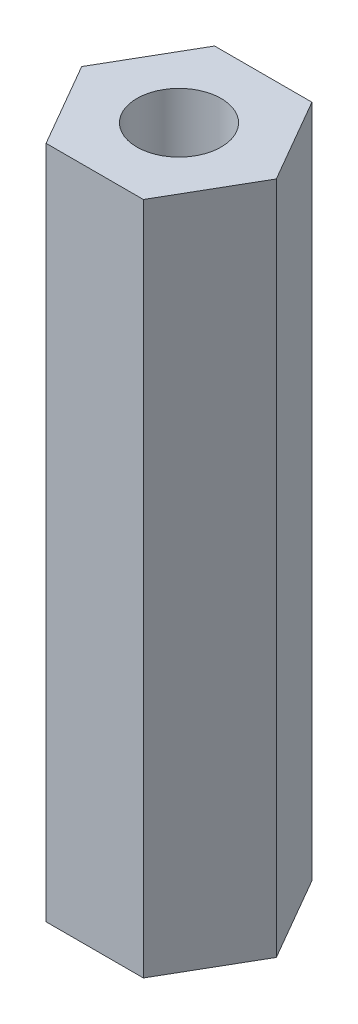
ISO-10303-21;
HEADER;
FILE_DESCRIPTION(('STEP AP214'),'2;1');
FILE_NAME('part.step','',(''),(''),'','','');
FILE_SCHEMA(('AUTOMOTIVE_DESIGN { 1 0 10303 214 1 1 1 1 }'));
ENDSEC;
DATA;
#1=APPLICATION_CONTEXT('core data for automotive mechanical design processes');
#2=APPLICATION_PROTOCOL_DEFINITION('international standard','automotive_design',2000,#1);
#3=PRODUCT_CONTEXT('',#1,'mechanical');
#4=PRODUCT('Part','Part','',(#3));
#5=PRODUCT_RELATED_PRODUCT_CATEGORY('part','',(#4));
#6=PRODUCT_DEFINITION_FORMATION('','',#4);
#7=PRODUCT_DEFINITION_CONTEXT('part definition',#1,'design');
#8=PRODUCT_DEFINITION('design','',#6,#7);
#9=PRODUCT_DEFINITION_SHAPE('','',#8);
#10=(LENGTH_UNIT() NAMED_UNIT(*) SI_UNIT(.MILLI.,.METRE.));
#11=(NAMED_UNIT(*) PLANE_ANGLE_UNIT() SI_UNIT($,.RADIAN.));
#12=(NAMED_UNIT(*) SI_UNIT($,.STERADIAN.) SOLID_ANGLE_UNIT());
#13=UNCERTAINTY_MEASURE_WITH_UNIT(LENGTH_MEASURE(1.E-05),#10,'distance_accuracy_value','');
#14=(GEOMETRIC_REPRESENTATION_CONTEXT(3) GLOBAL_UNCERTAINTY_ASSIGNED_CONTEXT((#13)) GLOBAL_UNIT_ASSIGNED_CONTEXT((#10,
#11,#12)) REPRESENTATION_CONTEXT('',''));
#15=CARTESIAN_POINT('',(0.,0.,0.));
#16=DIRECTION('',(0.,0.,1.));
#17=DIRECTION('',(1.,0.,0.));
#18=AXIS2_PLACEMENT_3D('',#15,#16,#17);
#19=CARTESIAN_POINT('',(-2.88675134592777,20.,4.16996623862909E-11));
#20=DIRECTION('',(-0.866025403784439,0.,-0.5));
#21=DIRECTION('',(-0.5,0.,0.866025403784439));
#22=AXIS2_PLACEMENT_3D('',#19,#20,#21);
#23=PLANE('',#22);
#24=DIRECTION('',(0.5,0.,-0.866025403784439));
#25=VECTOR('',#24,1.);
#26=CARTESIAN_POINT('',(-2.88675134592777,0.,4.16996623862909E-11));
#27=LINE('',#26,#25);
#28=CARTESIAN_POINT('',(-2.88675134592777,0.,4.16996623862909E-11));
#29=VERTEX_POINT('',#28);
#30=CARTESIAN_POINT('',(-1.44337567294723,0.,-2.49999999996953));
#31=VERTEX_POINT('',#30);
#32=EDGE_CURVE('E130',#29,#31,#27,.T.);
#33=ORIENTED_EDGE('',*,*,#32,.F.);
#34=DIRECTION('',(0.,-1.,0.));
#35=VECTOR('',#34,1.);
#36=CARTESIAN_POINT('',(-2.88675134592777,20.,4.16996623862909E-11));
#37=LINE('',#36,#35);
#38=CARTESIAN_POINT('',(-2.88675134592777,20.,4.16996623862909E-11));
#39=VERTEX_POINT('',#38);
#40=EDGE_CURVE('E11',#39,#29,#37,.T.);
#41=ORIENTED_EDGE('',*,*,#40,.F.);
#42=DIRECTION('',(0.5,0.,-0.866025403784439));
#43=VECTOR('',#42,1.);
#44=CARTESIAN_POINT('',(-2.88675134592777,20.,4.16996623862909E-11));
#45=LINE('',#44,#43);
#46=CARTESIAN_POINT('',(-1.44337567294723,20.,-2.49999999996953));
#47=VERTEX_POINT('',#46);
#48=EDGE_CURVE('E151',#39,#47,#45,.T.);
#49=ORIENTED_EDGE('',*,*,#48,.T.);
#50=DIRECTION('',(0.,-1.,0.));
#51=VECTOR('',#50,1.);
#52=CARTESIAN_POINT('',(-1.44337567294723,20.,-2.49999999996953));
#53=LINE('',#52,#51);
#54=EDGE_CURVE('E42',#47,#31,#53,.T.);
#55=ORIENTED_EDGE('',*,*,#54,.T.);
#56=EDGE_LOOP('',(#33,#41,#49,#55));
#57=FACE_BOUND('',#56,.T.);
#58=ADVANCED_FACE('F39',(#57),#23,.T.);
#59=CARTESIAN_POINT('',(-1.44337567298334,20.,2.49999999999038));
#60=DIRECTION('',(-0.866025403784439,0.,0.5));
#61=DIRECTION('',(0.5,0.,0.866025403784439));
#62=AXIS2_PLACEMENT_3D('',#59,#60,#61);
#63=PLANE('',#62);
#64=DIRECTION('',(-0.5,0.,-0.866025403784438));
#65=VECTOR('',#64,1.);
#66=CARTESIAN_POINT('',(-1.44337567298334,0.,2.49999999999038));
#67=LINE('',#66,#65);
#68=CARTESIAN_POINT('',(-1.44337567298334,0.,2.49999999999038));
#69=VERTEX_POINT('',#68);
#70=EDGE_CURVE('E148',#69,#29,#67,.T.);
#71=ORIENTED_EDGE('',*,*,#70,.F.);
#72=DIRECTION('',(0.,-1.,0.));
#73=VECTOR('',#72,1.);
#74=CARTESIAN_POINT('',(-1.44337567298334,20.,2.49999999999038));
#75=LINE('',#74,#73);
#76=CARTESIAN_POINT('',(-1.44337567298334,20.,2.49999999999038));
#77=VERTEX_POINT('',#76);
#78=EDGE_CURVE('E49',#77,#69,#75,.T.);
#79=ORIENTED_EDGE('',*,*,#78,.F.);
#80=DIRECTION('',(-0.5,0.,-0.866025403784438));
#81=VECTOR('',#80,1.);
#82=CARTESIAN_POINT('',(-1.44337567298334,20.,2.49999999999038));
#83=LINE('',#82,#81);
#84=EDGE_CURVE('E116',#77,#39,#83,.T.);
#85=ORIENTED_EDGE('',*,*,#84,.T.);
#86=ORIENTED_EDGE('',*,*,#40,.T.);
#87=EDGE_LOOP('',(#71,#79,#85,#86));
#88=FACE_BOUND('',#87,.T.);
#89=ADVANCED_FACE('F163',(#88),#63,.T.);
#90=CARTESIAN_POINT('',(1.44337567308889,20.,2.49999999999038));
#91=DIRECTION('',(0.,0.,1.));
#92=DIRECTION('',(1.,0.,0.));
#93=AXIS2_PLACEMENT_3D('',#90,#91,#92);
#94=PLANE('',#93);
#95=DIRECTION('',(-1.,0.,0.));
#96=VECTOR('',#95,1.);
#97=CARTESIAN_POINT('',(1.44337567308889,0.,2.49999999999038));
#98=LINE('',#97,#96);
#99=CARTESIAN_POINT('',(1.44337567308889,0.,2.49999999999038));
#100=VERTEX_POINT('',#99);
#101=EDGE_CURVE('E102',#100,#69,#98,.T.);
#102=ORIENTED_EDGE('',*,*,#101,.F.);
#103=DIRECTION('',(0.,-1.,0.));
#104=VECTOR('',#103,1.);
#105=CARTESIAN_POINT('',(1.44337567308889,20.,2.49999999999038));
#106=LINE('',#105,#104);
#107=CARTESIAN_POINT('',(1.44337567308889,20.,2.49999999999038));
#108=VERTEX_POINT('',#107);
#109=EDGE_CURVE('E97',#108,#100,#106,.T.);
#110=ORIENTED_EDGE('',*,*,#109,.F.);
#111=DIRECTION('',(-1.,0.,0.));
#112=VECTOR('',#111,1.);
#113=CARTESIAN_POINT('',(1.44337567308889,20.,2.49999999999038));
#114=LINE('',#113,#112);
#115=EDGE_CURVE('E100',#108,#77,#114,.T.);
#116=ORIENTED_EDGE('',*,*,#115,.T.);
#117=ORIENTED_EDGE('',*,*,#78,.T.);
#118=EDGE_LOOP('',(#102,#110,#116,#117));
#119=FACE_BOUND('',#118,.T.);
#120=ADVANCED_FACE('F99',(#119),#94,.T.);
#121=CARTESIAN_POINT('',(2.88675134603332,20.,-8.33997042433421E-11));
#122=DIRECTION('',(0.866025403795273,0.,0.499999999981235));
#123=DIRECTION('',(0.499999999981235,0.,-0.866025403795273));
#124=AXIS2_PLACEMENT_3D('',#121,#122,#123);
#125=PLANE('',#124);
#126=DIRECTION('',(-0.499999999981235,0.,0.866025403795273));
#127=VECTOR('',#126,1.);
#128=CARTESIAN_POINT('',(2.88675134603332,0.,-8.33997042433421E-11));
#129=LINE('',#128,#127);
#130=CARTESIAN_POINT('',(2.88675134603332,0.,-8.33997042433421E-11));
#131=VERTEX_POINT('',#130);
#132=EDGE_CURVE('E143',#131,#100,#129,.T.);
#133=ORIENTED_EDGE('',*,*,#132,.F.);
#134=DIRECTION('',(0.,-1.,0.));
#135=VECTOR('',#134,1.);
#136=CARTESIAN_POINT('',(2.88675134603332,20.,-8.33997042433421E-11));
#137=LINE('',#136,#135);
#138=CARTESIAN_POINT('',(2.88675134603332,20.,-8.33997042433421E-11));
#139=VERTEX_POINT('',#138);
#140=EDGE_CURVE('E108',#139,#131,#137,.T.);
#141=ORIENTED_EDGE('',*,*,#140,.F.);
#142=DIRECTION('',(-0.499999999981235,0.,0.866025403795273));
#143=VECTOR('',#142,1.);
#144=CARTESIAN_POINT('',(2.88675134603332,20.,-8.33997042433421E-11));
#145=LINE('',#144,#143);
#146=EDGE_CURVE('E114',#139,#108,#145,.T.);
#147=ORIENTED_EDGE('',*,*,#146,.T.);
#148=ORIENTED_EDGE('',*,*,#109,.T.);
#149=EDGE_LOOP('',(#133,#141,#147,#148));
#150=FACE_BOUND('',#149,.T.);
#151=ADVANCED_FACE('F119',(#150),#125,.T.);
#152=CARTESIAN_POINT('',(1.443375673125,20.,-2.49999999996953));
#153=DIRECTION('',(0.866025403784439,0.,-0.5));
#154=DIRECTION('',(-0.5,0.,-0.866025403784439));
#155=AXIS2_PLACEMENT_3D('',#152,#153,#154);
#156=PLANE('',#155);
#157=DIRECTION('',(0.5,0.,0.866025403784439));
#158=VECTOR('',#157,1.);
#159=CARTESIAN_POINT('',(1.443375673125,0.,-2.49999999996953));
#160=LINE('',#159,#158);
#161=CARTESIAN_POINT('',(1.443375673125,0.,-2.49999999996953));
#162=VERTEX_POINT('',#161);
#163=EDGE_CURVE('E139',#162,#131,#160,.T.);
#164=ORIENTED_EDGE('',*,*,#163,.F.);
#165=DIRECTION('',(0.,-1.,0.));
#166=VECTOR('',#165,1.);
#167=CARTESIAN_POINT('',(1.443375673125,20.,-2.49999999996953));
#168=LINE('',#167,#166);
#169=CARTESIAN_POINT('',(1.443375673125,20.,-2.49999999996953));
#170=VERTEX_POINT('',#169);
#171=EDGE_CURVE('E156',#170,#162,#168,.T.);
#172=ORIENTED_EDGE('',*,*,#171,.F.);
#173=DIRECTION('',(0.5,0.,0.866025403784439));
#174=VECTOR('',#173,1.);
#175=CARTESIAN_POINT('',(1.443375673125,20.,-2.49999999996953));
#176=LINE('',#175,#174);
#177=EDGE_CURVE('E121',#170,#139,#176,.T.);
#178=ORIENTED_EDGE('',*,*,#177,.T.);
#179=ORIENTED_EDGE('',*,*,#140,.T.);
#180=EDGE_LOOP('',(#164,#172,#178,#179));
#181=FACE_BOUND('',#180,.T.);
#182=ADVANCED_FACE('F176',(#181),#156,.T.);
#183=CARTESIAN_POINT('',(-1.44337567294723,20.,-2.49999999996953));
#184=DIRECTION('',(0.,0.,-1.));
#185=DIRECTION('',(-1.,0.,0.));
#186=AXIS2_PLACEMENT_3D('',#183,#184,#185);
#187=PLANE('',#186);
#188=DIRECTION('',(1.,0.,0.));
#189=VECTOR('',#188,1.);
#190=CARTESIAN_POINT('',(-1.44337567294723,0.,-2.49999999996953));
#191=LINE('',#190,#189);
#192=EDGE_CURVE('E134',#31,#162,#191,.T.);
#193=ORIENTED_EDGE('',*,*,#192,.F.);
#194=ORIENTED_EDGE('',*,*,#54,.F.);
#195=DIRECTION('',(1.,0.,0.));
#196=VECTOR('',#195,1.);
#197=CARTESIAN_POINT('',(-1.44337567294723,20.,-2.49999999996953));
#198=LINE('',#197,#196);
#199=EDGE_CURVE('E124',#47,#170,#198,.T.);
#200=ORIENTED_EDGE('',*,*,#199,.T.);
#201=ORIENTED_EDGE('',*,*,#171,.T.);
#202=EDGE_LOOP('',(#193,#194,#200,#201));
#203=FACE_BOUND('',#202,.T.);
#204=ADVANCED_FACE('F160',(#203),#187,.T.);
#205=CARTESIAN_POINT('',(0.,20.,0.));
#206=DIRECTION('',(0.,-1.,0.));
#207=DIRECTION('',(0.,0.,-1.));
#208=AXIS2_PLACEMENT_3D('',#205,#206,#207);
#209=PLANE('',#208);
#210=CARTESIAN_POINT('',(0.,20.,0.));
#211=DIRECTION('',(0.,-1.,0.));
#212=DIRECTION('',(0.,0.,1.));
#213=AXIS2_PLACEMENT_3D('',#210,#211,#212);
#214=CIRCLE('',#213,1.25);
#215=CARTESIAN_POINT('',(0.,20.,1.25));
#216=VERTEX_POINT('',#215);
#217=EDGE_CURVE('E135',#216,#216,#214,.T.);
#218=ORIENTED_EDGE('',*,*,#217,.T.);
#219=EDGE_LOOP('',(#218));
#220=FACE_BOUND('',#219,.T.);
#221=ORIENTED_EDGE('',*,*,#48,.F.);
#222=ORIENTED_EDGE('',*,*,#84,.F.);
#223=ORIENTED_EDGE('',*,*,#115,.F.);
#224=ORIENTED_EDGE('',*,*,#146,.F.);
#225=ORIENTED_EDGE('',*,*,#177,.F.);
#226=ORIENTED_EDGE('',*,*,#199,.F.);
#227=EDGE_LOOP('',(#221,#222,#223,#224,#225,#226));
#228=FACE_BOUND('',#227,.T.);
#229=ADVANCED_FACE('F112',(#220,#228),#209,.F.);
#230=CARTESIAN_POINT('',(0.,0.,0.));
#231=DIRECTION('',(0.,-1.,0.));
#232=DIRECTION('',(0.,0.,-1.));
#233=AXIS2_PLACEMENT_3D('',#230,#231,#232);
#234=PLANE('',#233);
#235=CARTESIAN_POINT('',(0.,0.,0.));
#236=DIRECTION('',(0.,-1.,0.));
#237=DIRECTION('',(0.,0.,1.));
#238=AXIS2_PLACEMENT_3D('',#235,#236,#237);
#239=CIRCLE('',#238,1.25);
#240=CARTESIAN_POINT('',(0.,0.,1.25));
#241=VERTEX_POINT('',#240);
#242=EDGE_CURVE('E199',#241,#241,#239,.T.);
#243=ORIENTED_EDGE('',*,*,#242,.F.);
#244=EDGE_LOOP('',(#243));
#245=FACE_BOUND('',#244,.T.);
#246=ORIENTED_EDGE('',*,*,#32,.T.);
#247=ORIENTED_EDGE('',*,*,#192,.T.);
#248=ORIENTED_EDGE('',*,*,#163,.T.);
#249=ORIENTED_EDGE('',*,*,#132,.T.);
#250=ORIENTED_EDGE('',*,*,#101,.T.);
#251=ORIENTED_EDGE('',*,*,#70,.T.);
#252=EDGE_LOOP('',(#246,#247,#248,#249,#250,#251));
#253=FACE_BOUND('',#252,.T.);
#254=ADVANCED_FACE('F162',(#245,#253),#234,.T.);
#255=CARTESIAN_POINT('',(0.,20.,0.));
#256=DIRECTION('',(0.,-1.,0.));
#257=DIRECTION('',(0.,0.,-1.));
#258=AXIS2_PLACEMENT_3D('',#255,#256,#257);
#259=CYLINDRICAL_SURFACE('',#258,1.25);
#260=ORIENTED_EDGE('',*,*,#217,.F.);
#261=EDGE_LOOP('',(#260));
#262=FACE_BOUND('',#261,.T.);
#263=ORIENTED_EDGE('',*,*,#242,.T.);
#264=EDGE_LOOP('',(#263));
#265=FACE_BOUND('',#264,.T.);
#266=ADVANCED_FACE('F187',(#262,#265),#259,.F.);
#267=CLOSED_SHELL('',(#58,#89,#120,#151,#182,#204,#229,#254,#266));
#268=MANIFOLD_SOLID_BREP('B2',#267);
#269=ADVANCED_BREP_SHAPE_REPRESENTATION('',(#18,#268),#14);
#270=SHAPE_DEFINITION_REPRESENTATION(#9,#269);
ENDSEC;
END-ISO-10303-21;
